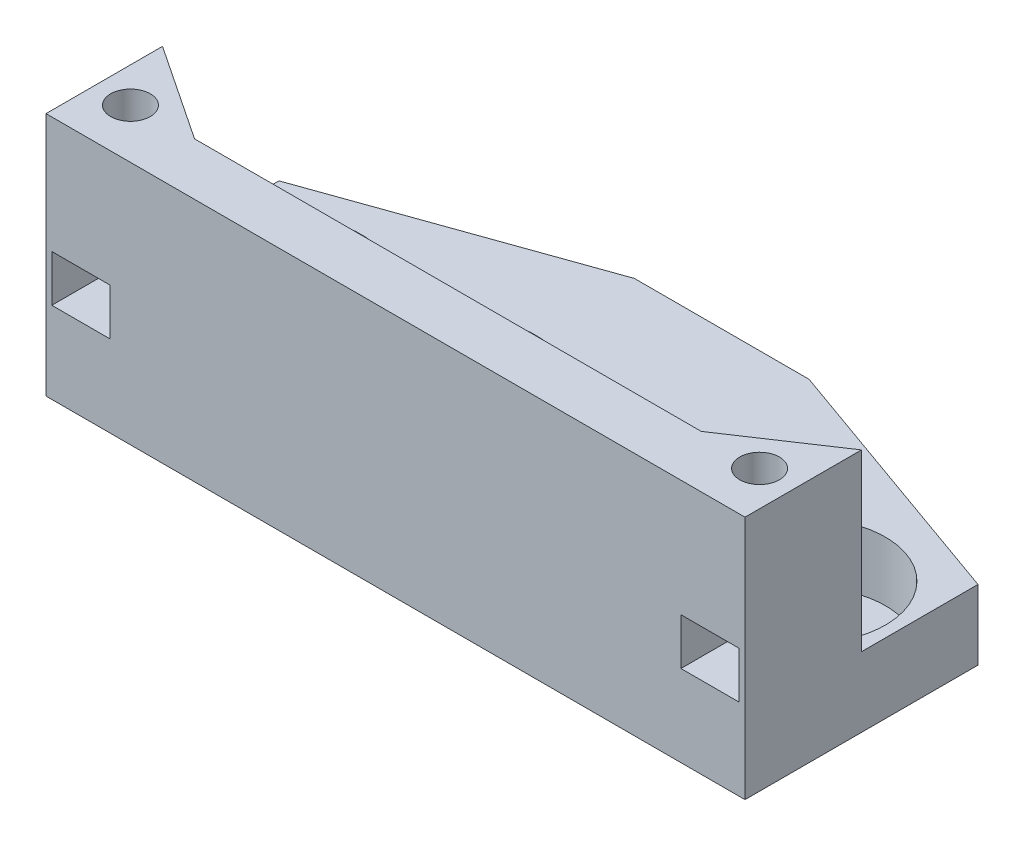
ISO-10303-21;
HEADER;
FILE_DESCRIPTION(('STEP AP214'),'2;1');
FILE_NAME('part.step','',(''),(''),'','','');
FILE_SCHEMA(('AUTOMOTIVE_DESIGN { 1 0 10303 214 1 1 1 1 }'));
ENDSEC;
DATA;
#1=APPLICATION_CONTEXT('core data for automotive mechanical design processes');
#2=APPLICATION_PROTOCOL_DEFINITION('international standard','automotive_design',2000,#1);
#3=PRODUCT_CONTEXT('',#1,'mechanical');
#4=PRODUCT('Part','Part','',(#3));
#5=PRODUCT_RELATED_PRODUCT_CATEGORY('part','',(#4));
#6=PRODUCT_DEFINITION_FORMATION('','',#4);
#7=PRODUCT_DEFINITION_CONTEXT('part definition',#1,'design');
#8=PRODUCT_DEFINITION('design','',#6,#7);
#9=PRODUCT_DEFINITION_SHAPE('','',#8);
#10=(LENGTH_UNIT() NAMED_UNIT(*) SI_UNIT(.MILLI.,.METRE.));
#11=(NAMED_UNIT(*) PLANE_ANGLE_UNIT() SI_UNIT($,.RADIAN.));
#12=(NAMED_UNIT(*) SI_UNIT($,.STERADIAN.) SOLID_ANGLE_UNIT());
#13=UNCERTAINTY_MEASURE_WITH_UNIT(LENGTH_MEASURE(1.E-05),#10,'distance_accuracy_value','');
#14=(GEOMETRIC_REPRESENTATION_CONTEXT(3) GLOBAL_UNCERTAINTY_ASSIGNED_CONTEXT((#13)) GLOBAL_UNIT_ASSIGNED_CONTEXT((#10,
#11,#12)) REPRESENTATION_CONTEXT('',''));
#15=CARTESIAN_POINT('',(0.,0.,0.));
#16=DIRECTION('',(0.,0.,1.));
#17=DIRECTION('',(1.,0.,0.));
#18=AXIS2_PLACEMENT_3D('',#15,#16,#17);
#19=CARTESIAN_POINT('',(0.,6.,0.));
#20=DIRECTION('',(0.,0.,-1.));
#21=DIRECTION('',(-1.,0.,0.));
#22=AXIS2_PLACEMENT_3D('',#19,#20,#21);
#23=PLANE('',#22);
#24=DIRECTION('',(0.,1.,0.));
#25=VECTOR('',#24,1.);
#26=CARTESIAN_POINT('',(0.500000000000001,7.,0.));
#27=LINE('',#26,#25);
#28=CARTESIAN_POINT('',(0.500000000000001,7.,0.));
#29=VERTEX_POINT('',#28);
#30=CARTESIAN_POINT('',(0.500000000000001,11.,0.));
#31=VERTEX_POINT('',#30);
#32=EDGE_CURVE('E230',#29,#31,#27,.T.);
#33=ORIENTED_EDGE('',*,*,#32,.T.);
#34=DIRECTION('',(1.,0.,0.));
#35=VECTOR('',#34,1.);
#36=CARTESIAN_POINT('',(0.,11.,0.));
#37=LINE('',#36,#35);
#38=CARTESIAN_POINT('',(5.5,11.,0.));
#39=VERTEX_POINT('',#38);
#40=EDGE_CURVE('E241',#31,#39,#37,.T.);
#41=ORIENTED_EDGE('',*,*,#40,.T.);
#42=DIRECTION('',(0.,1.,0.));
#43=VECTOR('',#42,1.);
#44=CARTESIAN_POINT('',(5.5,7.,0.));
#45=LINE('',#44,#43);
#46=CARTESIAN_POINT('',(5.5,7.,0.));
#47=VERTEX_POINT('',#46);
#48=EDGE_CURVE('E223',#47,#39,#45,.T.);
#49=ORIENTED_EDGE('',*,*,#48,.F.);
#50=DIRECTION('',(1.,0.,0.));
#51=VECTOR('',#50,1.);
#52=CARTESIAN_POINT('',(0.,7.,0.));
#53=LINE('',#52,#51);
#54=EDGE_CURVE('E231',#29,#47,#53,.T.);
#55=ORIENTED_EDGE('',*,*,#54,.F.);
#56=EDGE_LOOP('',(#33,#41,#49,#55));
#57=FACE_BOUND('',#56,.T.);
#58=DIRECTION('',(1.,0.,0.));
#59=VECTOR('',#58,1.);
#60=CARTESIAN_POINT('',(0.,0.,0.));
#61=LINE('',#60,#59);
#62=CARTESIAN_POINT('',(0.,0.,0.));
#63=VERTEX_POINT('',#62);
#64=CARTESIAN_POINT('',(60.,0.,0.));
#65=VERTEX_POINT('',#64);
#66=EDGE_CURVE('E412',#63,#65,#61,.T.);
#67=ORIENTED_EDGE('',*,*,#66,.T.);
#68=DIRECTION('',(0.,-1.,0.));
#69=VECTOR('',#68,1.);
#70=CARTESIAN_POINT('',(60.,6.,0.));
#71=LINE('',#70,#69);
#72=CARTESIAN_POINT('',(60.,21.,0.));
#73=VERTEX_POINT('',#72);
#74=EDGE_CURVE('E88',#73,#65,#71,.T.);
#75=ORIENTED_EDGE('',*,*,#74,.F.);
#76=DIRECTION('',(1.,0.,0.));
#77=VECTOR('',#76,1.);
#78=CARTESIAN_POINT('',(0.,21.,0.));
#79=LINE('',#78,#77);
#80=CARTESIAN_POINT('',(0.,21.,0.));
#81=VERTEX_POINT('',#80);
#82=EDGE_CURVE('E344',#81,#73,#79,.T.);
#83=ORIENTED_EDGE('',*,*,#82,.F.);
#84=DIRECTION('',(0.,-1.,0.));
#85=VECTOR('',#84,1.);
#86=CARTESIAN_POINT('',(0.,6.,0.));
#87=LINE('',#86,#85);
#88=EDGE_CURVE('E12',#81,#63,#87,.T.);
#89=ORIENTED_EDGE('',*,*,#88,.T.);
#90=EDGE_LOOP('',(#67,#75,#83,#89));
#91=FACE_BOUND('',#90,.T.);
#92=DIRECTION('',(1.,0.,0.));
#93=VECTOR('',#92,1.);
#94=CARTESIAN_POINT('',(0.,7.,0.));
#95=LINE('',#94,#93);
#96=CARTESIAN_POINT('',(54.5,7.,0.));
#97=VERTEX_POINT('',#96);
#98=CARTESIAN_POINT('',(59.5,7.,0.));
#99=VERTEX_POINT('',#98);
#100=EDGE_CURVE('E282',#97,#99,#95,.T.);
#101=ORIENTED_EDGE('',*,*,#100,.F.);
#102=DIRECTION('',(0.,1.,0.));
#103=VECTOR('',#102,1.);
#104=CARTESIAN_POINT('',(54.5,7.,0.));
#105=LINE('',#104,#103);
#106=CARTESIAN_POINT('',(54.5,11.,0.));
#107=VERTEX_POINT('',#106);
#108=EDGE_CURVE('E289',#97,#107,#105,.T.);
#109=ORIENTED_EDGE('',*,*,#108,.T.);
#110=DIRECTION('',(1.,0.,0.));
#111=VECTOR('',#110,1.);
#112=CARTESIAN_POINT('',(0.,11.,0.));
#113=LINE('',#112,#111);
#114=CARTESIAN_POINT('',(59.5,11.,0.));
#115=VERTEX_POINT('',#114);
#116=EDGE_CURVE('E297',#107,#115,#113,.T.);
#117=ORIENTED_EDGE('',*,*,#116,.T.);
#118=DIRECTION('',(0.,1.,0.));
#119=VECTOR('',#118,1.);
#120=CARTESIAN_POINT('',(59.5,7.,0.));
#121=LINE('',#120,#119);
#122=EDGE_CURVE('E293',#99,#115,#121,.T.);
#123=ORIENTED_EDGE('',*,*,#122,.F.);
#124=EDGE_LOOP('',(#101,#109,#117,#123));
#125=FACE_BOUND('',#124,.T.);
#126=ADVANCED_FACE('F78',(#57,#91,#125),#23,.F.);
#127=CARTESIAN_POINT('',(0.,6.,-20.));
#128=DIRECTION('',(1.,0.,0.));
#129=DIRECTION('',(0.,0.,-1.));
#130=AXIS2_PLACEMENT_3D('',#127,#128,#129);
#131=PLANE('',#130);
#132=DIRECTION('',(0.,0.,1.));
#133=VECTOR('',#132,1.);
#134=CARTESIAN_POINT('',(0.,0.,-20.));
#135=LINE('',#134,#133);
#136=CARTESIAN_POINT('',(0.,0.,-20.));
#137=VERTEX_POINT('',#136);
#138=EDGE_CURVE('E391',#137,#63,#135,.T.);
#139=ORIENTED_EDGE('',*,*,#138,.T.);
#140=ORIENTED_EDGE('',*,*,#88,.F.);
#141=DIRECTION('',(0.,0.,1.));
#142=VECTOR('',#141,1.);
#143=CARTESIAN_POINT('',(0.,21.,0.));
#144=LINE('',#143,#142);
#145=CARTESIAN_POINT('',(0.,21.,-10.));
#146=VERTEX_POINT('',#145);
#147=EDGE_CURVE('E362',#146,#81,#144,.T.);
#148=ORIENTED_EDGE('',*,*,#147,.F.);
#149=DIRECTION('',(0.,-1.,0.));
#150=VECTOR('',#149,1.);
#151=CARTESIAN_POINT('',(0.,21.,-10.));
#152=LINE('',#151,#150);
#153=CARTESIAN_POINT('',(0.,6.,-10.));
#154=VERTEX_POINT('',#153);
#155=EDGE_CURVE('E366',#146,#154,#152,.T.);
#156=ORIENTED_EDGE('',*,*,#155,.T.);
#157=DIRECTION('',(0.,0.,1.));
#158=VECTOR('',#157,1.);
#159=CARTESIAN_POINT('',(0.,6.,-20.));
#160=LINE('',#159,#158);
#161=CARTESIAN_POINT('',(0.,6.,-20.));
#162=VERTEX_POINT('',#161);
#163=EDGE_CURVE('E392',#162,#154,#160,.T.);
#164=ORIENTED_EDGE('',*,*,#163,.F.);
#165=DIRECTION('',(0.,-1.,0.));
#166=VECTOR('',#165,1.);
#167=CARTESIAN_POINT('',(0.,6.,-20.));
#168=LINE('',#167,#166);
#169=EDGE_CURVE('E408',#162,#137,#168,.T.);
#170=ORIENTED_EDGE('',*,*,#169,.T.);
#171=EDGE_LOOP('',(#139,#140,#148,#156,#164,#170));
#172=FACE_BOUND('',#171,.T.);
#173=ADVANCED_FACE('F80',(#172),#131,.F.);
#174=CARTESIAN_POINT('',(60.,6.,0.));
#175=DIRECTION('',(-1.,0.,0.));
#176=DIRECTION('',(0.,0.,1.));
#177=AXIS2_PLACEMENT_3D('',#174,#175,#176);
#178=PLANE('',#177);
#179=DIRECTION('',(0.,0.,-1.));
#180=VECTOR('',#179,1.);
#181=CARTESIAN_POINT('',(60.,0.,0.));
#182=LINE('',#181,#180);
#183=CARTESIAN_POINT('',(60.,0.,-20.));
#184=VERTEX_POINT('',#183);
#185=EDGE_CURVE('E415',#65,#184,#182,.T.);
#186=ORIENTED_EDGE('',*,*,#185,.T.);
#187=DIRECTION('',(0.,-1.,0.));
#188=VECTOR('',#187,1.);
#189=CARTESIAN_POINT('',(60.,6.,-20.));
#190=LINE('',#189,#188);
#191=CARTESIAN_POINT('',(60.,6.,-20.));
#192=VERTEX_POINT('',#191);
#193=EDGE_CURVE('E437',#192,#184,#190,.T.);
#194=ORIENTED_EDGE('',*,*,#193,.F.);
#195=DIRECTION('',(0.,0.,-1.));
#196=VECTOR('',#195,1.);
#197=CARTESIAN_POINT('',(60.,6.,0.));
#198=LINE('',#197,#196);
#199=CARTESIAN_POINT('',(60.,6.,-10.));
#200=VERTEX_POINT('',#199);
#201=EDGE_CURVE('E395',#200,#192,#198,.T.);
#202=ORIENTED_EDGE('',*,*,#201,.F.);
#203=DIRECTION('',(0.,-1.,0.));
#204=VECTOR('',#203,1.);
#205=CARTESIAN_POINT('',(60.,21.,-10.));
#206=LINE('',#205,#204);
#207=CARTESIAN_POINT('',(60.,21.,-10.));
#208=VERTEX_POINT('',#207);
#209=EDGE_CURVE('E387',#208,#200,#206,.T.);
#210=ORIENTED_EDGE('',*,*,#209,.F.);
#211=DIRECTION('',(0.,0.,-1.));
#212=VECTOR('',#211,1.);
#213=CARTESIAN_POINT('',(60.,21.,0.));
#214=LINE('',#213,#212);
#215=EDGE_CURVE('E348',#73,#208,#214,.T.);
#216=ORIENTED_EDGE('',*,*,#215,.F.);
#217=ORIENTED_EDGE('',*,*,#74,.T.);
#218=EDGE_LOOP('',(#186,#194,#202,#210,#216,#217));
#219=FACE_BOUND('',#218,.T.);
#220=ADVANCED_FACE('F507',(#219),#178,.F.);
#221=CARTESIAN_POINT('',(60.,6.,-20.));
#222=DIRECTION('',(-0.335009667654806,0.,0.942214690279141));
#223=DIRECTION('',(0.942214690279141,0.,0.335009667654806));
#224=AXIS2_PLACEMENT_3D('',#221,#222,#223);
#225=PLANE('',#224);
#226=DIRECTION('',(-0.942214690279141,0.,-0.335009667654806));
#227=VECTOR('',#226,1.);
#228=CARTESIAN_POINT('',(60.,0.,-20.));
#229=LINE('',#228,#227);
#230=CARTESIAN_POINT('',(37.5,0.,-28.));
#231=VERTEX_POINT('',#230);
#232=EDGE_CURVE('E418',#184,#231,#229,.T.);
#233=ORIENTED_EDGE('',*,*,#232,.T.);
#234=DIRECTION('',(0.,-1.,0.));
#235=VECTOR('',#234,1.);
#236=CARTESIAN_POINT('',(37.5,6.,-28.));
#237=LINE('',#236,#235);
#238=CARTESIAN_POINT('',(37.5,6.,-28.));
#239=VERTEX_POINT('',#238);
#240=EDGE_CURVE('E433',#239,#231,#237,.T.);
#241=ORIENTED_EDGE('',*,*,#240,.F.);
#242=DIRECTION('',(-0.942214690279141,0.,-0.335009667654806));
#243=VECTOR('',#242,1.);
#244=CARTESIAN_POINT('',(60.,6.,-20.));
#245=LINE('',#244,#243);
#246=EDGE_CURVE('E399',#192,#239,#245,.T.);
#247=ORIENTED_EDGE('',*,*,#246,.F.);
#248=ORIENTED_EDGE('',*,*,#193,.T.);
#249=EDGE_LOOP('',(#233,#241,#247,#248));
#250=FACE_BOUND('',#249,.T.);
#251=ADVANCED_FACE('F512',(#250),#225,.F.);
#252=CARTESIAN_POINT('',(37.5,6.,-28.));
#253=DIRECTION('',(0.,0.,1.));
#254=DIRECTION('',(1.,0.,0.));
#255=AXIS2_PLACEMENT_3D('',#252,#253,#254);
#256=PLANE('',#255);
#257=DIRECTION('',(-1.,0.,0.));
#258=VECTOR('',#257,1.);
#259=CARTESIAN_POINT('',(37.5,0.,-28.));
#260=LINE('',#259,#258);
#261=CARTESIAN_POINT('',(22.5,0.,-28.));
#262=VERTEX_POINT('',#261);
#263=EDGE_CURVE('E421',#231,#262,#260,.T.);
#264=ORIENTED_EDGE('',*,*,#263,.T.);
#265=DIRECTION('',(0.,-1.,0.));
#266=VECTOR('',#265,1.);
#267=CARTESIAN_POINT('',(22.5,6.,-28.));
#268=LINE('',#267,#266);
#269=CARTESIAN_POINT('',(22.5,6.,-28.));
#270=VERTEX_POINT('',#269);
#271=EDGE_CURVE('E429',#270,#262,#268,.T.);
#272=ORIENTED_EDGE('',*,*,#271,.F.);
#273=DIRECTION('',(-1.,0.,0.));
#274=VECTOR('',#273,1.);
#275=CARTESIAN_POINT('',(37.5,6.,-28.));
#276=LINE('',#275,#274);
#277=EDGE_CURVE('E402',#239,#270,#276,.T.);
#278=ORIENTED_EDGE('',*,*,#277,.F.);
#279=ORIENTED_EDGE('',*,*,#240,.T.);
#280=EDGE_LOOP('',(#264,#272,#278,#279));
#281=FACE_BOUND('',#280,.T.);
#282=ADVANCED_FACE('F516',(#281),#256,.F.);
#283=CARTESIAN_POINT('',(22.5,6.,-28.));
#284=DIRECTION('',(0.335009667654805,0.,0.94221469027914));
#285=DIRECTION('',(0.942214690279141,0.,-0.335009667654805));
#286=AXIS2_PLACEMENT_3D('',#283,#284,#285);
#287=PLANE('',#286);
#288=DIRECTION('',(-0.942214690279141,0.,0.335009667654806));
#289=VECTOR('',#288,1.);
#290=CARTESIAN_POINT('',(22.5,0.,-28.));
#291=LINE('',#290,#289);
#292=EDGE_CURVE('E396',#262,#137,#291,.T.);
#293=ORIENTED_EDGE('',*,*,#292,.T.);
#294=ORIENTED_EDGE('',*,*,#169,.F.);
#295=DIRECTION('',(-0.942214690279141,0.,0.335009667654806));
#296=VECTOR('',#295,1.);
#297=CARTESIAN_POINT('',(22.5,6.,-28.));
#298=LINE('',#297,#296);
#299=EDGE_CURVE('E405',#270,#162,#298,.T.);
#300=ORIENTED_EDGE('',*,*,#299,.F.);
#301=ORIENTED_EDGE('',*,*,#271,.T.);
#302=EDGE_LOOP('',(#293,#294,#300,#301));
#303=FACE_BOUND('',#302,.T.);
#304=ADVANCED_FACE('F520',(#303),#287,.F.);
#305=CARTESIAN_POINT('',(0.,6.,0.));
#306=DIRECTION('',(0.,1.,0.));
#307=DIRECTION('',(0.,0.,1.));
#308=AXIS2_PLACEMENT_3D('',#305,#306,#307);
#309=PLANE('',#308);
#310=CARTESIAN_POINT('',(52.5,6.,-13.));
#311=DIRECTION('',(0.,1.,0.));
#312=DIRECTION('',(0.,0.,1.));
#313=AXIS2_PLACEMENT_3D('',#310,#311,#312);
#314=CIRCLE('',#313,6.54999999999999);
#315=CARTESIAN_POINT('',(52.5,6.,-6.45000000000001));
#316=VERTEX_POINT('',#315);
#317=EDGE_CURVE('E660',#316,#316,#314,.T.);
#318=ORIENTED_EDGE('',*,*,#317,.F.);
#319=EDGE_LOOP('',(#318));
#320=FACE_BOUND('',#319,.T.);
#321=CARTESIAN_POINT('',(37.5,6.,-13.));
#322=DIRECTION('',(0.,1.,0.));
#323=DIRECTION('',(0.,0.,1.));
#324=AXIS2_PLACEMENT_3D('',#321,#322,#323);
#325=CIRCLE('',#324,6.55);
#326=CARTESIAN_POINT('',(37.5,6.,-6.45));
#327=VERTEX_POINT('',#326);
#328=EDGE_CURVE('E668',#327,#327,#325,.T.);
#329=ORIENTED_EDGE('',*,*,#328,.F.);
#330=EDGE_LOOP('',(#329));
#331=FACE_BOUND('',#330,.T.);
#332=CARTESIAN_POINT('',(22.5,6.,-13.));
#333=DIRECTION('',(0.,1.,0.));
#334=DIRECTION('',(0.,0.,1.));
#335=AXIS2_PLACEMENT_3D('',#332,#333,#334);
#336=CIRCLE('',#335,6.55);
#337=CARTESIAN_POINT('',(22.5,6.,-6.45));
#338=VERTEX_POINT('',#337);
#339=EDGE_CURVE('E470',#338,#338,#336,.T.);
#340=ORIENTED_EDGE('',*,*,#339,.F.);
#341=EDGE_LOOP('',(#340));
#342=FACE_BOUND('',#341,.T.);
#343=CARTESIAN_POINT('',(7.5,6.,-13.));
#344=DIRECTION('',(0.,1.,0.));
#345=DIRECTION('',(0.,0.,1.));
#346=AXIS2_PLACEMENT_3D('',#343,#344,#345);
#347=CIRCLE('',#346,6.55);
#348=CARTESIAN_POINT('',(7.5,6.,-6.45));
#349=VERTEX_POINT('',#348);
#350=EDGE_CURVE('E459',#349,#349,#347,.T.);
#351=ORIENTED_EDGE('',*,*,#350,.F.);
#352=EDGE_LOOP('',(#351));
#353=FACE_BOUND('',#352,.T.);
#354=DIRECTION('',(-0.832050294337844,0.,-0.554700196225229));
#355=VECTOR('',#354,1.);
#356=CARTESIAN_POINT('',(4.61538461538462,6.,-6.92307692307692));
#357=LINE('',#356,#355);
#358=CARTESIAN_POINT('',(8.25000000000001,6.,-4.5));
#359=VERTEX_POINT('',#358);
#360=EDGE_CURVE('E349',#359,#154,#357,.T.);
#361=ORIENTED_EDGE('',*,*,#360,.F.);
#362=DIRECTION('',(1.,0.,0.));
#363=VECTOR('',#362,1.);
#364=CARTESIAN_POINT('',(0.,6.,-4.5));
#365=LINE('',#364,#363);
#366=CARTESIAN_POINT('',(51.75,6.,-4.5));
#367=VERTEX_POINT('',#366);
#368=EDGE_CURVE('E370',#359,#367,#365,.T.);
#369=ORIENTED_EDGE('',*,*,#368,.T.);
#370=DIRECTION('',(-0.832050294337844,0.,0.554700196225229));
#371=VECTOR('',#370,1.);
#372=CARTESIAN_POINT('',(13.8461538461539,6.,20.7692307692308));
#373=LINE('',#372,#371);
#374=EDGE_CURVE('E339',#200,#367,#373,.T.);
#375=ORIENTED_EDGE('',*,*,#374,.F.);
#376=ORIENTED_EDGE('',*,*,#201,.T.);
#377=ORIENTED_EDGE('',*,*,#246,.T.);
#378=ORIENTED_EDGE('',*,*,#277,.T.);
#379=ORIENTED_EDGE('',*,*,#299,.T.);
#380=ORIENTED_EDGE('',*,*,#163,.T.);
#381=EDGE_LOOP('',(#361,#369,#375,#376,#377,#378,#379,#380));
#382=FACE_BOUND('',#381,.T.);
#383=ADVANCED_FACE('F524',(#320,#331,#342,#353,#382),#309,.T.);
#384=CARTESIAN_POINT('',(0.,0.,0.));
#385=DIRECTION('',(0.,1.,0.));
#386=DIRECTION('',(0.,0.,1.));
#387=AXIS2_PLACEMENT_3D('',#384,#385,#386);
#388=PLANE('',#387);
#389=CARTESIAN_POINT('',(7.5,0.,-13.));
#390=DIRECTION('',(0.,1.,0.));
#391=DIRECTION('',(0.,0.,1.));
#392=AXIS2_PLACEMENT_3D('',#389,#390,#391);
#393=CIRCLE('',#392,2.15);
#394=CARTESIAN_POINT('',(7.5,0.,-10.85));
#395=VERTEX_POINT('',#394);
#396=EDGE_CURVE('E449',#395,#395,#393,.T.);
#397=ORIENTED_EDGE('',*,*,#396,.T.);
#398=EDGE_LOOP('',(#397));
#399=FACE_BOUND('',#398,.T.);
#400=CARTESIAN_POINT('',(22.5,0.,-13.));
#401=DIRECTION('',(0.,1.,0.));
#402=DIRECTION('',(0.,0.,1.));
#403=AXIS2_PLACEMENT_3D('',#400,#401,#402);
#404=CIRCLE('',#403,2.15);
#405=CARTESIAN_POINT('',(22.5,0.,-10.85));
#406=VERTEX_POINT('',#405);
#407=EDGE_CURVE('E643',#406,#406,#404,.T.);
#408=ORIENTED_EDGE('',*,*,#407,.T.);
#409=EDGE_LOOP('',(#408));
#410=FACE_BOUND('',#409,.T.);
#411=CARTESIAN_POINT('',(37.5,0.,-13.));
#412=DIRECTION('',(0.,1.,0.));
#413=DIRECTION('',(0.,0.,1.));
#414=AXIS2_PLACEMENT_3D('',#411,#412,#413);
#415=CIRCLE('',#414,2.15);
#416=CARTESIAN_POINT('',(37.5,0.,-10.85));
#417=VERTEX_POINT('',#416);
#418=EDGE_CURVE('E647',#417,#417,#415,.T.);
#419=ORIENTED_EDGE('',*,*,#418,.T.);
#420=EDGE_LOOP('',(#419));
#421=FACE_BOUND('',#420,.T.);
#422=CARTESIAN_POINT('',(52.5,0.,-13.));
#423=DIRECTION('',(0.,1.,0.));
#424=DIRECTION('',(0.,0.,1.));
#425=AXIS2_PLACEMENT_3D('',#422,#423,#424);
#426=CIRCLE('',#425,2.15);
#427=CARTESIAN_POINT('',(52.5,0.,-10.85));
#428=VERTEX_POINT('',#427);
#429=EDGE_CURVE('E653',#428,#428,#426,.T.);
#430=ORIENTED_EDGE('',*,*,#429,.T.);
#431=EDGE_LOOP('',(#430));
#432=FACE_BOUND('',#431,.T.);
#433=ORIENTED_EDGE('',*,*,#138,.F.);
#434=ORIENTED_EDGE('',*,*,#292,.F.);
#435=ORIENTED_EDGE('',*,*,#263,.F.);
#436=ORIENTED_EDGE('',*,*,#232,.F.);
#437=ORIENTED_EDGE('',*,*,#185,.F.);
#438=ORIENTED_EDGE('',*,*,#66,.F.);
#439=EDGE_LOOP('',(#433,#434,#435,#436,#437,#438));
#440=FACE_BOUND('',#439,.T.);
#441=ADVANCED_FACE('F526',(#399,#410,#421,#432,#440),#388,.F.);
#442=CARTESIAN_POINT('',(13.8461538461539,21.,20.7692307692308));
#443=DIRECTION('',(0.554700196225229,0.,0.832050294337844));
#444=DIRECTION('',(0.832050294337844,0.,-0.554700196225229));
#445=AXIS2_PLACEMENT_3D('',#442,#443,#444);
#446=PLANE('',#445);
#447=ORIENTED_EDGE('',*,*,#374,.T.);
#448=DIRECTION('',(0.,-1.,0.));
#449=VECTOR('',#448,1.);
#450=CARTESIAN_POINT('',(51.75,21.,-4.5));
#451=LINE('',#450,#449);
#452=CARTESIAN_POINT('',(51.75,21.,-4.5));
#453=VERTEX_POINT('',#452);
#454=EDGE_CURVE('E383',#453,#367,#451,.T.);
#455=ORIENTED_EDGE('',*,*,#454,.F.);
#456=DIRECTION('',(-0.832050294337844,0.,0.554700196225229));
#457=VECTOR('',#456,1.);
#458=CARTESIAN_POINT('',(13.8461538461539,21.,20.7692307692308));
#459=LINE('',#458,#457);
#460=EDGE_CURVE('E352',#208,#453,#459,.T.);
#461=ORIENTED_EDGE('',*,*,#460,.F.);
#462=ORIENTED_EDGE('',*,*,#209,.T.);
#463=EDGE_LOOP('',(#447,#455,#461,#462));
#464=FACE_BOUND('',#463,.T.);
#465=ADVANCED_FACE('F529',(#464),#446,.F.);
#466=CARTESIAN_POINT('',(0.,21.,-4.5));
#467=DIRECTION('',(0.,0.,-1.));
#468=DIRECTION('',(-1.,0.,0.));
#469=AXIS2_PLACEMENT_3D('',#466,#467,#468);
#470=PLANE('',#469);
#471=ORIENTED_EDGE('',*,*,#368,.F.);
#472=DIRECTION('',(0.,-1.,0.));
#473=VECTOR('',#472,1.);
#474=CARTESIAN_POINT('',(8.25000000000001,21.,-4.5));
#475=LINE('',#474,#473);
#476=CARTESIAN_POINT('',(8.25000000000001,21.,-4.5));
#477=VERTEX_POINT('',#476);
#478=EDGE_CURVE('E379',#477,#359,#475,.T.);
#479=ORIENTED_EDGE('',*,*,#478,.F.);
#480=DIRECTION('',(1.,0.,0.));
#481=VECTOR('',#480,1.);
#482=CARTESIAN_POINT('',(0.,21.,-4.5));
#483=LINE('',#482,#481);
#484=EDGE_CURVE('E355',#477,#453,#483,.T.);
#485=ORIENTED_EDGE('',*,*,#484,.T.);
#486=ORIENTED_EDGE('',*,*,#454,.T.);
#487=EDGE_LOOP('',(#471,#479,#485,#486));
#488=FACE_BOUND('',#487,.T.);
#489=ADVANCED_FACE('F536',(#488),#470,.T.);
#490=CARTESIAN_POINT('',(4.61538461538462,21.,-6.92307692307692));
#491=DIRECTION('',(-0.554700196225229,0.,0.832050294337844));
#492=DIRECTION('',(0.832050294337844,0.,0.554700196225229));
#493=AXIS2_PLACEMENT_3D('',#490,#491,#492);
#494=PLANE('',#493);
#495=ORIENTED_EDGE('',*,*,#360,.T.);
#496=ORIENTED_EDGE('',*,*,#155,.F.);
#497=DIRECTION('',(-0.832050294337844,0.,-0.554700196225229));
#498=VECTOR('',#497,1.);
#499=CARTESIAN_POINT('',(4.61538461538462,21.,-6.92307692307692));
#500=LINE('',#499,#498);
#501=EDGE_CURVE('E359',#477,#146,#500,.T.);
#502=ORIENTED_EDGE('',*,*,#501,.F.);
#503=ORIENTED_EDGE('',*,*,#478,.T.);
#504=EDGE_LOOP('',(#495,#496,#502,#503));
#505=FACE_BOUND('',#504,.T.);
#506=ADVANCED_FACE('F540',(#505),#494,.F.);
#507=CARTESIAN_POINT('',(0.,21.,0.));
#508=DIRECTION('',(0.,1.,0.));
#509=DIRECTION('',(0.,0.,1.));
#510=AXIS2_PLACEMENT_3D('',#507,#508,#509);
#511=PLANE('',#510);
#512=CARTESIAN_POINT('',(3.,21.,-4.25));
#513=DIRECTION('',(0.,1.,0.));
#514=DIRECTION('',(0.,0.,1.));
#515=AXIS2_PLACEMENT_3D('',#512,#513,#514);
#516=CIRCLE('',#515,1.7);
#517=CARTESIAN_POINT('',(3.,21.,-2.55));
#518=VERTEX_POINT('',#517);
#519=EDGE_CURVE('E336',#518,#518,#516,.T.);
#520=ORIENTED_EDGE('',*,*,#519,.F.);
#521=EDGE_LOOP('',(#520));
#522=FACE_BOUND('',#521,.T.);
#523=CARTESIAN_POINT('',(57.,21.,-4.25));
#524=DIRECTION('',(0.,1.,0.));
#525=DIRECTION('',(0.,0.,1.));
#526=AXIS2_PLACEMENT_3D('',#523,#524,#525);
#527=CIRCLE('',#526,1.7);
#528=CARTESIAN_POINT('',(57.,21.,-2.55));
#529=VERTEX_POINT('',#528);
#530=EDGE_CURVE('E335',#529,#529,#527,.T.);
#531=ORIENTED_EDGE('',*,*,#530,.F.);
#532=EDGE_LOOP('',(#531));
#533=FACE_BOUND('',#532,.T.);
#534=ORIENTED_EDGE('',*,*,#82,.T.);
#535=ORIENTED_EDGE('',*,*,#215,.T.);
#536=ORIENTED_EDGE('',*,*,#460,.T.);
#537=ORIENTED_EDGE('',*,*,#484,.F.);
#538=ORIENTED_EDGE('',*,*,#501,.T.);
#539=ORIENTED_EDGE('',*,*,#147,.T.);
#540=EDGE_LOOP('',(#534,#535,#536,#537,#538,#539));
#541=FACE_BOUND('',#540,.T.);
#542=ADVANCED_FACE('F544',(#522,#533,#541),#511,.T.);
#543=CARTESIAN_POINT('',(57.,11.,-4.25));
#544=DIRECTION('',(0.,1.,0.));
#545=DIRECTION('',(0.,0.,1.));
#546=AXIS2_PLACEMENT_3D('',#543,#544,#545);
#547=CYLINDRICAL_SURFACE('',#546,1.7);
#548=CARTESIAN_POINT('',(57.,11.,-4.25));
#549=DIRECTION('',(0.,1.,0.));
#550=DIRECTION('',(0.,0.,1.));
#551=AXIS2_PLACEMENT_3D('',#548,#549,#550);
#552=CIRCLE('',#551,1.7);
#553=CARTESIAN_POINT('',(57.,11.,-2.55));
#554=VERTEX_POINT('',#553);
#555=EDGE_CURVE('E243',#554,#554,#552,.T.);
#556=ORIENTED_EDGE('',*,*,#555,.F.);
#557=EDGE_LOOP('',(#556));
#558=FACE_BOUND('',#557,.T.);
#559=ORIENTED_EDGE('',*,*,#530,.T.);
#560=EDGE_LOOP('',(#559));
#561=FACE_BOUND('',#560,.T.);
#562=ADVANCED_FACE('F548',(#558,#561),#547,.F.);
#563=CARTESIAN_POINT('',(3.,11.,-4.25));
#564=DIRECTION('',(0.,1.,0.));
#565=DIRECTION('',(0.,0.,1.));
#566=AXIS2_PLACEMENT_3D('',#563,#564,#565);
#567=CYLINDRICAL_SURFACE('',#566,1.7);
#568=CARTESIAN_POINT('',(3.,11.,-4.25));
#569=DIRECTION('',(0.,1.,0.));
#570=DIRECTION('',(0.,0.,1.));
#571=AXIS2_PLACEMENT_3D('',#568,#569,#570);
#572=CIRCLE('',#571,1.7);
#573=CARTESIAN_POINT('',(3.,11.,-2.55));
#574=VERTEX_POINT('',#573);
#575=EDGE_CURVE('E248',#574,#574,#572,.T.);
#576=ORIENTED_EDGE('',*,*,#575,.F.);
#577=EDGE_LOOP('',(#576));
#578=FACE_BOUND('',#577,.T.);
#579=ORIENTED_EDGE('',*,*,#519,.T.);
#580=EDGE_LOOP('',(#579));
#581=FACE_BOUND('',#580,.T.);
#582=ADVANCED_FACE('F552',(#578,#581),#567,.F.);
#583=CARTESIAN_POINT('',(59.5,7.,0.));
#584=DIRECTION('',(-1.,0.,0.));
#585=DIRECTION('',(0.,0.,1.));
#586=AXIS2_PLACEMENT_3D('',#583,#584,#585);
#587=PLANE('',#586);
#588=DIRECTION('',(0.,0.,1.));
#589=VECTOR('',#588,1.);
#590=CARTESIAN_POINT('',(59.5,11.,0.));
#591=LINE('',#590,#589);
#592=CARTESIAN_POINT('',(59.5,11.,-5.69337567297406));
#593=VERTEX_POINT('',#592);
#594=EDGE_CURVE('E104',#593,#115,#591,.T.);
#595=ORIENTED_EDGE('',*,*,#594,.F.);
#596=DIRECTION('',(0.,1.,0.));
#597=VECTOR('',#596,1.);
#598=CARTESIAN_POINT('',(59.5,7.,-5.69337567297406));
#599=LINE('',#598,#597);
#600=CARTESIAN_POINT('',(59.5,7.,-5.69337567297406));
#601=VERTEX_POINT('',#600);
#602=EDGE_CURVE('E279',#601,#593,#599,.T.);
#603=ORIENTED_EDGE('',*,*,#602,.F.);
#604=DIRECTION('',(0.,0.,1.));
#605=VECTOR('',#604,1.);
#606=CARTESIAN_POINT('',(59.5,7.,0.));
#607=LINE('',#606,#605);
#608=EDGE_CURVE('E302',#601,#99,#607,.T.);
#609=ORIENTED_EDGE('',*,*,#608,.T.);
#610=ORIENTED_EDGE('',*,*,#122,.T.);
#611=EDGE_LOOP('',(#595,#603,#609,#610));
#612=FACE_BOUND('',#611,.T.);
#613=ADVANCED_FACE('F556',(#612),#587,.T.);
#614=CARTESIAN_POINT('',(54.5,7.,-1.34741837060778E-13));
#615=DIRECTION('',(1.,0.,0.));
#616=DIRECTION('',(0.,0.,-1.));
#617=AXIS2_PLACEMENT_3D('',#614,#615,#616);
#618=PLANE('',#617);
#619=DIRECTION('',(0.,0.,-1.));
#620=VECTOR('',#619,1.);
#621=CARTESIAN_POINT('',(54.5,11.,-1.34741837060778E-13));
#622=LINE('',#621,#620);
#623=CARTESIAN_POINT('',(54.5,11.,-5.69337567297406));
#624=VERTEX_POINT('',#623);
#625=EDGE_CURVE('E301',#107,#624,#622,.T.);
#626=ORIENTED_EDGE('',*,*,#625,.F.);
#627=ORIENTED_EDGE('',*,*,#108,.F.);
#628=DIRECTION('',(0.,0.,-1.));
#629=VECTOR('',#628,1.);
#630=CARTESIAN_POINT('',(54.5,7.,-1.34741837060778E-13));
#631=LINE('',#630,#629);
#632=CARTESIAN_POINT('',(54.5,7.,-5.69337567297406));
#633=VERTEX_POINT('',#632);
#634=EDGE_CURVE('E319',#97,#633,#631,.T.);
#635=ORIENTED_EDGE('',*,*,#634,.T.);
#636=DIRECTION('',(0.,1.,0.));
#637=VECTOR('',#636,1.);
#638=CARTESIAN_POINT('',(54.5,7.,-5.69337567297406));
#639=LINE('',#638,#637);
#640=EDGE_CURVE('E286',#633,#624,#639,.T.);
#641=ORIENTED_EDGE('',*,*,#640,.T.);
#642=EDGE_LOOP('',(#626,#627,#635,#641));
#643=FACE_BOUND('',#642,.T.);
#644=ADVANCED_FACE('F566',(#643),#618,.T.);
#645=CARTESIAN_POINT('',(11.1596960169581,7.,19.3291604983954));
#646=DIRECTION('',(-0.500000000000001,0.,-0.866025403784438));
#647=DIRECTION('',(-0.866025403784438,0.,0.500000000000001));
#648=AXIS2_PLACEMENT_3D('',#645,#646,#647);
#649=PLANE('',#648);
#650=DIRECTION('',(-0.866025403784438,0.,0.500000000000001));
#651=VECTOR('',#650,1.);
#652=CARTESIAN_POINT('',(11.1596960169581,11.,19.3291604983954));
#653=LINE('',#652,#651);
#654=CARTESIAN_POINT('',(57.,11.,-7.13675134594813));
#655=VERTEX_POINT('',#654);
#656=EDGE_CURVE('E306',#655,#624,#653,.T.);
#657=ORIENTED_EDGE('',*,*,#656,.T.);
#658=ORIENTED_EDGE('',*,*,#640,.F.);
#659=DIRECTION('',(-0.866025403784438,0.,0.500000000000001));
#660=VECTOR('',#659,1.);
#661=CARTESIAN_POINT('',(11.1596960169581,7.,19.3291604983954));
#662=LINE('',#661,#660);
#663=CARTESIAN_POINT('',(57.,7.,-7.13675134594813));
#664=VERTEX_POINT('',#663);
#665=EDGE_CURVE('E322',#664,#633,#662,.T.);
#666=ORIENTED_EDGE('',*,*,#665,.F.);
#667=DIRECTION('',(0.,1.,0.));
#668=VECTOR('',#667,1.);
#669=CARTESIAN_POINT('',(57.,7.,-7.13675134594813));
#670=LINE('',#669,#668);
#671=EDGE_CURVE('E283',#664,#655,#670,.T.);
#672=ORIENTED_EDGE('',*,*,#671,.T.);
#673=EDGE_LOOP('',(#657,#658,#666,#672));
#674=FACE_BOUND('',#673,.T.);
#675=ADVANCED_FACE('F569',(#674),#649,.F.);
#676=CARTESIAN_POINT('',(17.3403039830419,7.,-30.0342875173176));
#677=DIRECTION('',(0.5,0.,-0.866025403784439));
#678=DIRECTION('',(-0.866025403784439,0.,-0.5));
#679=AXIS2_PLACEMENT_3D('',#676,#677,#678);
#680=PLANE('',#679);
#681=DIRECTION('',(-0.866025403784439,0.,-0.5));
#682=VECTOR('',#681,1.);
#683=CARTESIAN_POINT('',(17.3403039830419,11.,-30.0342875173176));
#684=LINE('',#683,#682);
#685=EDGE_CURVE('E310',#593,#655,#684,.T.);
#686=ORIENTED_EDGE('',*,*,#685,.T.);
#687=ORIENTED_EDGE('',*,*,#671,.F.);
#688=DIRECTION('',(-0.866025403784439,0.,-0.5));
#689=VECTOR('',#688,1.);
#690=CARTESIAN_POINT('',(17.3403039830419,7.,-30.0342875173176));
#691=LINE('',#690,#689);
#692=EDGE_CURVE('E326',#601,#664,#691,.T.);
#693=ORIENTED_EDGE('',*,*,#692,.F.);
#694=ORIENTED_EDGE('',*,*,#602,.T.);
#695=EDGE_LOOP('',(#686,#687,#693,#694));
#696=FACE_BOUND('',#695,.T.);
#697=ADVANCED_FACE('F561',(#696),#680,.F.);
#698=CARTESIAN_POINT('',(0.,7.,0.));
#699=DIRECTION('',(0.,1.,0.));
#700=DIRECTION('',(0.,0.,1.));
#701=AXIS2_PLACEMENT_3D('',#698,#699,#700);
#702=PLANE('',#701);
#703=ORIENTED_EDGE('',*,*,#608,.F.);
#704=ORIENTED_EDGE('',*,*,#692,.T.);
#705=ORIENTED_EDGE('',*,*,#665,.T.);
#706=ORIENTED_EDGE('',*,*,#634,.F.);
#707=ORIENTED_EDGE('',*,*,#100,.T.);
#708=EDGE_LOOP('',(#703,#704,#705,#706,#707));
#709=FACE_BOUND('',#708,.T.);
#710=ADVANCED_FACE('F558',(#709),#702,.T.);
#711=CARTESIAN_POINT('',(0.,11.,0.));
#712=DIRECTION('',(0.,1.,0.));
#713=DIRECTION('',(0.,0.,1.));
#714=AXIS2_PLACEMENT_3D('',#711,#712,#713);
#715=PLANE('',#714);
#716=ORIENTED_EDGE('',*,*,#555,.T.);
#717=EDGE_LOOP('',(#716));
#718=FACE_BOUND('',#717,.T.);
#719=ORIENTED_EDGE('',*,*,#594,.T.);
#720=ORIENTED_EDGE('',*,*,#116,.F.);
#721=ORIENTED_EDGE('',*,*,#625,.T.);
#722=ORIENTED_EDGE('',*,*,#656,.F.);
#723=ORIENTED_EDGE('',*,*,#685,.F.);
#724=EDGE_LOOP('',(#719,#720,#721,#722,#723));
#725=FACE_BOUND('',#724,.T.);
#726=ADVANCED_FACE('F500',(#718,#725),#715,.F.);
#727=CARTESIAN_POINT('',(5.5,7.,0.));
#728=DIRECTION('',(-1.,0.,0.));
#729=DIRECTION('',(0.,0.,1.));
#730=AXIS2_PLACEMENT_3D('',#727,#728,#729);
#731=PLANE('',#730);
#732=DIRECTION('',(0.,0.,1.));
#733=VECTOR('',#732,1.);
#734=CARTESIAN_POINT('',(5.5,11.,0.));
#735=LINE('',#734,#733);
#736=CARTESIAN_POINT('',(5.5,11.,-5.69337567297406));
#737=VERTEX_POINT('',#736);
#738=EDGE_CURVE('E252',#737,#39,#735,.T.);
#739=ORIENTED_EDGE('',*,*,#738,.F.);
#740=DIRECTION('',(0.,1.,0.));
#741=VECTOR('',#740,1.);
#742=CARTESIAN_POINT('',(5.5,7.,-5.69337567297406));
#743=LINE('',#742,#741);
#744=CARTESIAN_POINT('',(5.5,7.,-5.69337567297406));
#745=VERTEX_POINT('',#744);
#746=EDGE_CURVE('E226',#745,#737,#743,.T.);
#747=ORIENTED_EDGE('',*,*,#746,.F.);
#748=DIRECTION('',(0.,0.,1.));
#749=VECTOR('',#748,1.);
#750=CARTESIAN_POINT('',(5.5,7.,0.));
#751=LINE('',#750,#749);
#752=EDGE_CURVE('E220',#745,#47,#751,.T.);
#753=ORIENTED_EDGE('',*,*,#752,.T.);
#754=ORIENTED_EDGE('',*,*,#48,.T.);
#755=EDGE_LOOP('',(#739,#747,#753,#754));
#756=FACE_BOUND('',#755,.T.);
#757=ADVANCED_FACE('F221',(#756),#731,.T.);
#758=CARTESIAN_POINT('',(0.500000000000001,7.,0.));
#759=DIRECTION('',(-1.,0.,0.));
#760=DIRECTION('',(0.,0.,1.));
#761=AXIS2_PLACEMENT_3D('',#758,#759,#760);
#762=PLANE('',#761);
#763=DIRECTION('',(0.,0.,1.));
#764=VECTOR('',#763,1.);
#765=CARTESIAN_POINT('',(0.500000000000001,11.,0.));
#766=LINE('',#765,#764);
#767=CARTESIAN_POINT('',(0.500000000000001,11.,-5.69337567297406));
#768=VERTEX_POINT('',#767);
#769=EDGE_CURVE('E273',#768,#31,#766,.T.);
#770=ORIENTED_EDGE('',*,*,#769,.T.);
#771=ORIENTED_EDGE('',*,*,#32,.F.);
#772=DIRECTION('',(0.,0.,1.));
#773=VECTOR('',#772,1.);
#774=CARTESIAN_POINT('',(0.500000000000001,7.,0.));
#775=LINE('',#774,#773);
#776=CARTESIAN_POINT('',(0.500000000000001,7.,-5.69337567297406));
#777=VERTEX_POINT('',#776);
#778=EDGE_CURVE('E96',#777,#29,#775,.T.);
#779=ORIENTED_EDGE('',*,*,#778,.F.);
#780=DIRECTION('',(0.,1.,0.));
#781=VECTOR('',#780,1.);
#782=CARTESIAN_POINT('',(0.500000000000001,7.,-5.69337567297406));
#783=LINE('',#782,#781);
#784=EDGE_CURVE('E269',#777,#768,#783,.T.);
#785=ORIENTED_EDGE('',*,*,#784,.T.);
#786=EDGE_LOOP('',(#770,#771,#779,#785));
#787=FACE_BOUND('',#786,.T.);
#788=ADVANCED_FACE('F491',(#787),#762,.F.);
#789=CARTESIAN_POINT('',(0.,11.,0.));
#790=DIRECTION('',(0.,1.,0.));
#791=DIRECTION('',(0.,0.,1.));
#792=AXIS2_PLACEMENT_3D('',#789,#790,#791);
#793=PLANE('',#792);
#794=ORIENTED_EDGE('',*,*,#575,.T.);
#795=EDGE_LOOP('',(#794));
#796=FACE_BOUND('',#795,.T.);
#797=DIRECTION('',(-0.866025403784439,0.,0.5));
#798=VECTOR('',#797,1.);
#799=CARTESIAN_POINT('',(3.,11.,-7.13675134594813));
#800=LINE('',#799,#798);
#801=CARTESIAN_POINT('',(3.,11.,-7.13675134594813));
#802=VERTEX_POINT('',#801);
#803=EDGE_CURVE('E259',#802,#768,#800,.T.);
#804=ORIENTED_EDGE('',*,*,#803,.F.);
#805=DIRECTION('',(-0.866025403784439,0.,-0.5));
#806=VECTOR('',#805,1.);
#807=CARTESIAN_POINT('',(5.5,11.,-5.69337567297406));
#808=LINE('',#807,#806);
#809=EDGE_CURVE('E262',#737,#802,#808,.T.);
#810=ORIENTED_EDGE('',*,*,#809,.F.);
#811=ORIENTED_EDGE('',*,*,#738,.T.);
#812=ORIENTED_EDGE('',*,*,#40,.F.);
#813=ORIENTED_EDGE('',*,*,#769,.F.);
#814=EDGE_LOOP('',(#804,#810,#811,#812,#813));
#815=FACE_BOUND('',#814,.T.);
#816=ADVANCED_FACE('F483',(#796,#815),#793,.F.);
#817=CARTESIAN_POINT('',(0.,7.,0.));
#818=DIRECTION('',(0.,1.,0.));
#819=DIRECTION('',(0.,0.,1.));
#820=AXIS2_PLACEMENT_3D('',#817,#818,#819);
#821=PLANE('',#820);
#822=ORIENTED_EDGE('',*,*,#778,.T.);
#823=ORIENTED_EDGE('',*,*,#54,.T.);
#824=ORIENTED_EDGE('',*,*,#752,.F.);
#825=DIRECTION('',(-0.866025403784439,0.,-0.5));
#826=VECTOR('',#825,1.);
#827=CARTESIAN_POINT('',(5.5,7.,-5.69337567297406));
#828=LINE('',#827,#826);
#829=CARTESIAN_POINT('',(3.,7.,-7.13675134594813));
#830=VERTEX_POINT('',#829);
#831=EDGE_CURVE('E255',#745,#830,#828,.T.);
#832=ORIENTED_EDGE('',*,*,#831,.T.);
#833=DIRECTION('',(-0.866025403784439,0.,0.5));
#834=VECTOR('',#833,1.);
#835=CARTESIAN_POINT('',(3.,7.,-7.13675134594813));
#836=LINE('',#835,#834);
#837=EDGE_CURVE('E258',#830,#777,#836,.T.);
#838=ORIENTED_EDGE('',*,*,#837,.T.);
#839=EDGE_LOOP('',(#822,#823,#824,#832,#838));
#840=FACE_BOUND('',#839,.T.);
#841=ADVANCED_FACE('F234',(#840),#821,.T.);
#842=CARTESIAN_POINT('',(3.,7.,-7.13675134594813));
#843=DIRECTION('',(-0.5,0.,-0.866025403784439));
#844=DIRECTION('',(-0.866025403784439,0.,0.5));
#845=AXIS2_PLACEMENT_3D('',#842,#843,#844);
#846=PLANE('',#845);
#847=ORIENTED_EDGE('',*,*,#803,.T.);
#848=ORIENTED_EDGE('',*,*,#784,.F.);
#849=ORIENTED_EDGE('',*,*,#837,.F.);
#850=DIRECTION('',(0.,1.,0.));
#851=VECTOR('',#850,1.);
#852=CARTESIAN_POINT('',(3.,7.,-7.13675134594813));
#853=LINE('',#852,#851);
#854=EDGE_CURVE('E274',#830,#802,#853,.T.);
#855=ORIENTED_EDGE('',*,*,#854,.T.);
#856=EDGE_LOOP('',(#847,#848,#849,#855));
#857=FACE_BOUND('',#856,.T.);
#858=ADVANCED_FACE('F489',(#857),#846,.F.);
#859=CARTESIAN_POINT('',(5.5,7.,-5.69337567297406));
#860=DIRECTION('',(0.5,0.,-0.866025403784439));
#861=DIRECTION('',(-0.866025403784439,0.,-0.5));
#862=AXIS2_PLACEMENT_3D('',#859,#860,#861);
#863=PLANE('',#862);
#864=ORIENTED_EDGE('',*,*,#809,.T.);
#865=ORIENTED_EDGE('',*,*,#854,.F.);
#866=ORIENTED_EDGE('',*,*,#831,.F.);
#867=ORIENTED_EDGE('',*,*,#746,.T.);
#868=EDGE_LOOP('',(#864,#865,#866,#867));
#869=FACE_BOUND('',#868,.T.);
#870=ADVANCED_FACE('F485',(#869),#863,.F.);
#871=CARTESIAN_POINT('',(7.5,0.900000000000001,-13.));
#872=DIRECTION('',(0.,1.,0.));
#873=DIRECTION('',(0.,0.,1.));
#874=AXIS2_PLACEMENT_3D('',#871,#872,#873);
#875=CYLINDRICAL_SURFACE('',#874,6.55);
#876=CARTESIAN_POINT('',(7.5,0.900000000000001,-13.));
#877=DIRECTION('',(0.,1.,0.));
#878=DIRECTION('',(0.,0.,1.));
#879=AXIS2_PLACEMENT_3D('',#876,#877,#878);
#880=CIRCLE('',#879,6.55);
#881=CARTESIAN_POINT('',(7.5,0.900000000000001,-6.45));
#882=VERTEX_POINT('',#881);
#883=EDGE_CURVE('E464',#882,#882,#880,.T.);
#884=ORIENTED_EDGE('',*,*,#883,.F.);
#885=EDGE_LOOP('',(#884));
#886=FACE_BOUND('',#885,.T.);
#887=ORIENTED_EDGE('',*,*,#350,.T.);
#888=EDGE_LOOP('',(#887));
#889=FACE_BOUND('',#888,.T.);
#890=ADVANCED_FACE('F581',(#886,#889),#875,.F.);
#891=CARTESIAN_POINT('',(0.,0.900000000000001,0.));
#892=DIRECTION('',(0.,1.,0.));
#893=DIRECTION('',(0.,0.,1.));
#894=AXIS2_PLACEMENT_3D('',#891,#892,#893);
#895=PLANE('',#894);
#896=CARTESIAN_POINT('',(7.5,0.900000000000001,-13.));
#897=DIRECTION('',(0.,1.,0.));
#898=DIRECTION('',(0.,0.,1.));
#899=AXIS2_PLACEMENT_3D('',#896,#897,#898);
#900=CIRCLE('',#899,2.15);
#901=CARTESIAN_POINT('',(7.5,0.900000000000001,-10.85));
#902=VERTEX_POINT('',#901);
#903=EDGE_CURVE('E82',#902,#902,#900,.T.);
#904=ORIENTED_EDGE('',*,*,#903,.F.);
#905=EDGE_LOOP('',(#904));
#906=FACE_BOUND('',#905,.T.);
#907=ORIENTED_EDGE('',*,*,#883,.T.);
#908=EDGE_LOOP('',(#907));
#909=FACE_BOUND('',#908,.T.);
#910=ADVANCED_FACE('F591',(#906,#909),#895,.T.);
#911=CARTESIAN_POINT('',(22.5,0.900000000000001,-13.));
#912=DIRECTION('',(0.,1.,0.));
#913=DIRECTION('',(0.,0.,1.));
#914=AXIS2_PLACEMENT_3D('',#911,#912,#913);
#915=CYLINDRICAL_SURFACE('',#914,6.55);
#916=CARTESIAN_POINT('',(22.5,0.900000000000001,-13.));
#917=DIRECTION('',(0.,1.,0.));
#918=DIRECTION('',(0.,0.,1.));
#919=AXIS2_PLACEMENT_3D('',#916,#917,#918);
#920=CIRCLE('',#919,6.55);
#921=CARTESIAN_POINT('',(22.5,0.900000000000001,-6.45));
#922=VERTEX_POINT('',#921);
#923=EDGE_CURVE('E672',#922,#922,#920,.T.);
#924=ORIENTED_EDGE('',*,*,#923,.F.);
#925=EDGE_LOOP('',(#924));
#926=FACE_BOUND('',#925,.T.);
#927=ORIENTED_EDGE('',*,*,#339,.T.);
#928=EDGE_LOOP('',(#927));
#929=FACE_BOUND('',#928,.T.);
#930=ADVANCED_FACE('F596',(#926,#929),#915,.F.);
#931=CARTESIAN_POINT('',(0.,0.900000000000001,0.));
#932=DIRECTION('',(0.,1.,0.));
#933=DIRECTION('',(0.,0.,1.));
#934=AXIS2_PLACEMENT_3D('',#931,#932,#933);
#935=PLANE('',#934);
#936=CARTESIAN_POINT('',(22.5,0.900000000000001,-13.));
#937=DIRECTION('',(0.,1.,0.));
#938=DIRECTION('',(0.,0.,1.));
#939=AXIS2_PLACEMENT_3D('',#936,#937,#938);
#940=CIRCLE('',#939,2.15);
#941=CARTESIAN_POINT('',(22.5,0.900000000000001,-10.85));
#942=VERTEX_POINT('',#941);
#943=EDGE_CURVE('E452',#942,#942,#940,.T.);
#944=ORIENTED_EDGE('',*,*,#943,.F.);
#945=EDGE_LOOP('',(#944));
#946=FACE_BOUND('',#945,.T.);
#947=ORIENTED_EDGE('',*,*,#923,.T.);
#948=EDGE_LOOP('',(#947));
#949=FACE_BOUND('',#948,.T.);
#950=ADVANCED_FACE('F603',(#946,#949),#935,.T.);
#951=CARTESIAN_POINT('',(37.5,0.900000000000001,-13.));
#952=DIRECTION('',(0.,1.,0.));
#953=DIRECTION('',(0.,0.,1.));
#954=AXIS2_PLACEMENT_3D('',#951,#952,#953);
#955=CYLINDRICAL_SURFACE('',#954,6.55);
#956=CARTESIAN_POINT('',(37.5,0.900000000000001,-13.));
#957=DIRECTION('',(0.,1.,0.));
#958=DIRECTION('',(0.,0.,1.));
#959=AXIS2_PLACEMENT_3D('',#956,#957,#958);
#960=CIRCLE('',#959,6.55);
#961=CARTESIAN_POINT('',(37.5,0.900000000000001,-6.45));
#962=VERTEX_POINT('',#961);
#963=EDGE_CURVE('E664',#962,#962,#960,.T.);
#964=ORIENTED_EDGE('',*,*,#963,.F.);
#965=EDGE_LOOP('',(#964));
#966=FACE_BOUND('',#965,.T.);
#967=ORIENTED_EDGE('',*,*,#328,.T.);
#968=EDGE_LOOP('',(#967));
#969=FACE_BOUND('',#968,.T.);
#970=ADVANCED_FACE('F607',(#966,#969),#955,.F.);
#971=CARTESIAN_POINT('',(0.,0.900000000000001,0.));
#972=DIRECTION('',(0.,1.,0.));
#973=DIRECTION('',(0.,0.,1.));
#974=AXIS2_PLACEMENT_3D('',#971,#972,#973);
#975=PLANE('',#974);
#976=CARTESIAN_POINT('',(37.5,0.900000000000001,-13.));
#977=DIRECTION('',(0.,1.,0.));
#978=DIRECTION('',(0.,0.,1.));
#979=AXIS2_PLACEMENT_3D('',#976,#977,#978);
#980=CIRCLE('',#979,2.15);
#981=CARTESIAN_POINT('',(37.5,0.900000000000001,-10.85));
#982=VERTEX_POINT('',#981);
#983=EDGE_CURVE('E448',#982,#982,#980,.T.);
#984=ORIENTED_EDGE('',*,*,#983,.F.);
#985=EDGE_LOOP('',(#984));
#986=FACE_BOUND('',#985,.T.);
#987=ORIENTED_EDGE('',*,*,#963,.T.);
#988=EDGE_LOOP('',(#987));
#989=FACE_BOUND('',#988,.T.);
#990=ADVANCED_FACE('F611',(#986,#989),#975,.T.);
#991=CARTESIAN_POINT('',(52.5,0.900000000000001,-13.));
#992=DIRECTION('',(0.,1.,0.));
#993=DIRECTION('',(0.,0.,1.));
#994=AXIS2_PLACEMENT_3D('',#991,#992,#993);
#995=CYLINDRICAL_SURFACE('',#994,6.54999999999999);
#996=CARTESIAN_POINT('',(52.5,0.900000000000001,-13.));
#997=DIRECTION('',(0.,1.,0.));
#998=DIRECTION('',(0.,0.,1.));
#999=AXIS2_PLACEMENT_3D('',#996,#997,#998);
#1000=CIRCLE('',#999,6.54999999999999);
#1001=CARTESIAN_POINT('',(52.5,0.900000000000001,-6.45000000000001));
#1002=VERTEX_POINT('',#1001);
#1003=EDGE_CURVE('E296',#1002,#1002,#1000,.T.);
#1004=ORIENTED_EDGE('',*,*,#1003,.F.);
#1005=EDGE_LOOP('',(#1004));
#1006=FACE_BOUND('',#1005,.T.);
#1007=ORIENTED_EDGE('',*,*,#317,.T.);
#1008=EDGE_LOOP('',(#1007));
#1009=FACE_BOUND('',#1008,.T.);
#1010=ADVANCED_FACE('F615',(#1006,#1009),#995,.F.);
#1011=CARTESIAN_POINT('',(0.,0.900000000000001,0.));
#1012=DIRECTION('',(0.,1.,0.));
#1013=DIRECTION('',(0.,0.,1.));
#1014=AXIS2_PLACEMENT_3D('',#1011,#1012,#1013);
#1015=PLANE('',#1014);
#1016=CARTESIAN_POINT('',(52.5,0.900000000000001,-13.));
#1017=DIRECTION('',(0.,1.,0.));
#1018=DIRECTION('',(0.,0.,1.));
#1019=AXIS2_PLACEMENT_3D('',#1016,#1017,#1018);
#1020=CIRCLE('',#1019,2.15);
#1021=CARTESIAN_POINT('',(52.5,0.900000000000001,-10.85));
#1022=VERTEX_POINT('',#1021);
#1023=EDGE_CURVE('E444',#1022,#1022,#1020,.T.);
#1024=ORIENTED_EDGE('',*,*,#1023,.F.);
#1025=EDGE_LOOP('',(#1024));
#1026=FACE_BOUND('',#1025,.T.);
#1027=ORIENTED_EDGE('',*,*,#1003,.T.);
#1028=EDGE_LOOP('',(#1027));
#1029=FACE_BOUND('',#1028,.T.);
#1030=ADVANCED_FACE('F619',(#1026,#1029),#1015,.T.);
#1031=CARTESIAN_POINT('',(52.5,0.,-13.));
#1032=DIRECTION('',(0.,1.,0.));
#1033=DIRECTION('',(0.,0.,1.));
#1034=AXIS2_PLACEMENT_3D('',#1031,#1032,#1033);
#1035=CYLINDRICAL_SURFACE('',#1034,2.15);
#1036=ORIENTED_EDGE('',*,*,#1023,.T.);
#1037=EDGE_LOOP('',(#1036));
#1038=FACE_BOUND('',#1037,.T.);
#1039=ORIENTED_EDGE('',*,*,#429,.F.);
#1040=EDGE_LOOP('',(#1039));
#1041=FACE_BOUND('',#1040,.T.);
#1042=ADVANCED_FACE('F623',(#1038,#1041),#1035,.F.);
#1043=CARTESIAN_POINT('',(37.5,0.,-13.));
#1044=DIRECTION('',(0.,1.,0.));
#1045=DIRECTION('',(0.,0.,1.));
#1046=AXIS2_PLACEMENT_3D('',#1043,#1044,#1045);
#1047=CYLINDRICAL_SURFACE('',#1046,2.15);
#1048=ORIENTED_EDGE('',*,*,#983,.T.);
#1049=EDGE_LOOP('',(#1048));
#1050=FACE_BOUND('',#1049,.T.);
#1051=ORIENTED_EDGE('',*,*,#418,.F.);
#1052=EDGE_LOOP('',(#1051));
#1053=FACE_BOUND('',#1052,.T.);
#1054=ADVANCED_FACE('F627',(#1050,#1053),#1047,.F.);
#1055=CARTESIAN_POINT('',(22.5,0.,-13.));
#1056=DIRECTION('',(0.,1.,0.));
#1057=DIRECTION('',(0.,0.,1.));
#1058=AXIS2_PLACEMENT_3D('',#1055,#1056,#1057);
#1059=CYLINDRICAL_SURFACE('',#1058,2.15);
#1060=ORIENTED_EDGE('',*,*,#943,.T.);
#1061=EDGE_LOOP('',(#1060));
#1062=FACE_BOUND('',#1061,.T.);
#1063=ORIENTED_EDGE('',*,*,#407,.F.);
#1064=EDGE_LOOP('',(#1063));
#1065=FACE_BOUND('',#1064,.T.);
#1066=ADVANCED_FACE('F631',(#1062,#1065),#1059,.F.);
#1067=CARTESIAN_POINT('',(7.5,0.,-13.));
#1068=DIRECTION('',(0.,1.,0.));
#1069=DIRECTION('',(0.,0.,1.));
#1070=AXIS2_PLACEMENT_3D('',#1067,#1068,#1069);
#1071=CYLINDRICAL_SURFACE('',#1070,2.15);
#1072=ORIENTED_EDGE('',*,*,#903,.T.);
#1073=EDGE_LOOP('',(#1072));
#1074=FACE_BOUND('',#1073,.T.);
#1075=ORIENTED_EDGE('',*,*,#396,.F.);
#1076=EDGE_LOOP('',(#1075));
#1077=FACE_BOUND('',#1076,.T.);
#1078=ADVANCED_FACE('F635',(#1074,#1077),#1071,.F.);
#1079=CLOSED_SHELL('',(#126,#173,#220,#251,#282,#304,#383,#441,#465,#489,#506,#542,#562,#582,
#613,#644,#675,#697,#710,#726,#757,#788,#816,#841,#858,#870,#890,#910,#930,#950,#970,#990,#1010,
#1030,#1042,#1054,#1066,#1078));
#1080=MANIFOLD_SOLID_BREP('B2',#1079);
#1081=ADVANCED_BREP_SHAPE_REPRESENTATION('',(#18,#1080),#14);
#1082=SHAPE_DEFINITION_REPRESENTATION(#9,#1081);
ENDSEC;
END-ISO-10303-21;
